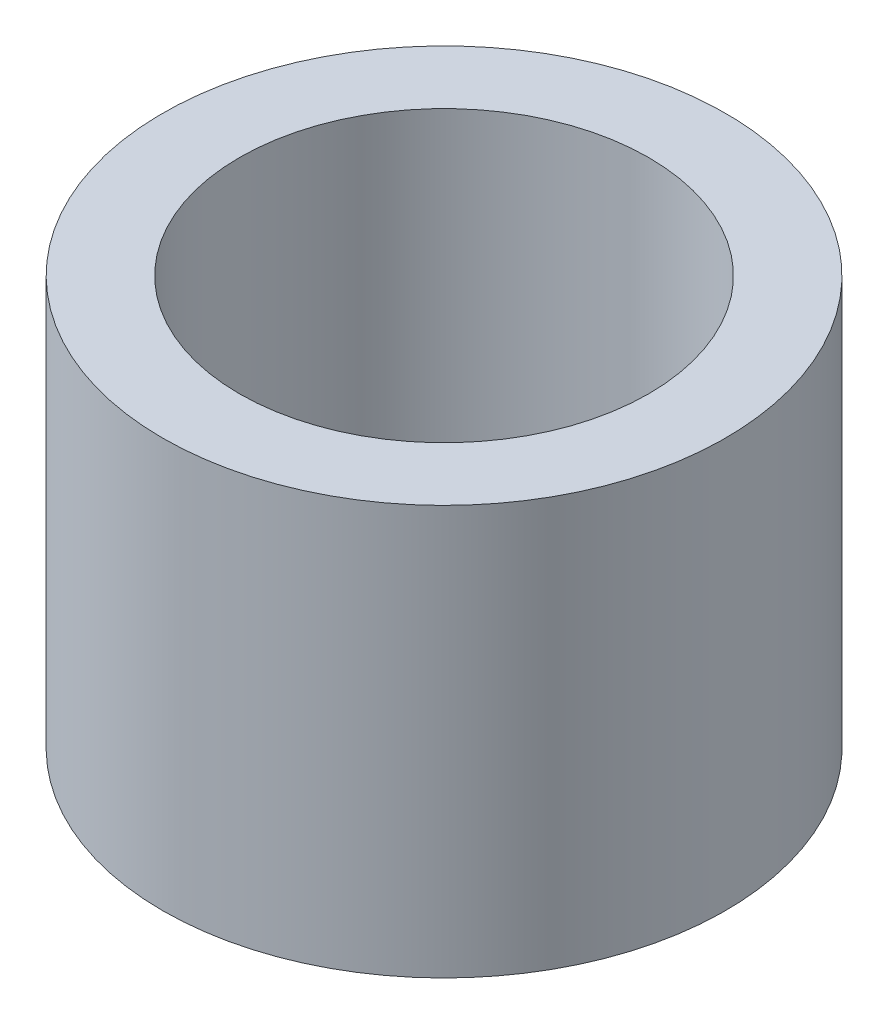
ISO-10303-21;
HEADER;
FILE_DESCRIPTION(('STEP AP214'),'2;1');
FILE_NAME('part.step','',(''),(''),'','','');
FILE_SCHEMA(('AUTOMOTIVE_DESIGN { 1 0 10303 214 1 1 1 1 }'));
ENDSEC;
DATA;
#1=APPLICATION_CONTEXT('core data for automotive mechanical design processes');
#2=APPLICATION_PROTOCOL_DEFINITION('international standard','automotive_design',2000,#1);
#3=PRODUCT_CONTEXT('',#1,'mechanical');
#4=PRODUCT('Part','Part','',(#3));
#5=PRODUCT_RELATED_PRODUCT_CATEGORY('part','',(#4));
#6=PRODUCT_DEFINITION_FORMATION('','',#4);
#7=PRODUCT_DEFINITION_CONTEXT('part definition',#1,'design');
#8=PRODUCT_DEFINITION('design','',#6,#7);
#9=PRODUCT_DEFINITION_SHAPE('','',#8);
#10=(LENGTH_UNIT() NAMED_UNIT(*) SI_UNIT(.MILLI.,.METRE.));
#11=(NAMED_UNIT(*) PLANE_ANGLE_UNIT() SI_UNIT($,.RADIAN.));
#12=(NAMED_UNIT(*) SI_UNIT($,.STERADIAN.) SOLID_ANGLE_UNIT());
#13=UNCERTAINTY_MEASURE_WITH_UNIT(LENGTH_MEASURE(1.E-05),#10,'distance_accuracy_value','');
#14=(GEOMETRIC_REPRESENTATION_CONTEXT(3) GLOBAL_UNCERTAINTY_ASSIGNED_CONTEXT((#13)) GLOBAL_UNIT_ASSIGNED_CONTEXT((#10,
#11,#12)) REPRESENTATION_CONTEXT('',''));
#15=CARTESIAN_POINT('',(0.,0.,0.));
#16=DIRECTION('',(0.,0.,1.));
#17=DIRECTION('',(1.,0.,0.));
#18=AXIS2_PLACEMENT_3D('',#15,#16,#17);
#19=CARTESIAN_POINT('',(0.,16.,0.));
#20=DIRECTION('',(0.,1.,0.));
#21=DIRECTION('',(0.,0.,1.));
#22=AXIS2_PLACEMENT_3D('',#19,#20,#21);
#23=PLANE('',#22);
#24=CARTESIAN_POINT('',(0.,16.,0.));
#25=DIRECTION('',(0.,1.,0.));
#26=DIRECTION('',(0.,0.,1.));
#27=AXIS2_PLACEMENT_3D('',#24,#25,#26);
#28=CIRCLE('',#27,11.);
#29=CARTESIAN_POINT('',(0.,16.,11.));
#30=VERTEX_POINT('',#29);
#31=EDGE_CURVE('E10',#30,#30,#28,.T.);
#32=ORIENTED_EDGE('',*,*,#31,.T.);
#33=EDGE_LOOP('',(#32));
#34=FACE_BOUND('',#33,.T.);
#35=CARTESIAN_POINT('',(0.,16.,0.));
#36=DIRECTION('',(0.,1.,0.));
#37=DIRECTION('',(0.,0.,1.));
#38=AXIS2_PLACEMENT_3D('',#35,#36,#37);
#39=CIRCLE('',#38,8.);
#40=CARTESIAN_POINT('',(0.,16.,8.));
#41=VERTEX_POINT('',#40);
#42=EDGE_CURVE('E46',#41,#41,#39,.T.);
#43=ORIENTED_EDGE('',*,*,#42,.F.);
#44=EDGE_LOOP('',(#43));
#45=FACE_BOUND('',#44,.T.);
#46=ADVANCED_FACE('F35',(#34,#45),#23,.T.);
#47=CARTESIAN_POINT('',(0.,0.,0.));
#48=DIRECTION('',(0.,1.,0.));
#49=DIRECTION('',(0.,0.,1.));
#50=AXIS2_PLACEMENT_3D('',#47,#48,#49);
#51=PLANE('',#50);
#52=CARTESIAN_POINT('',(0.,0.,0.));
#53=DIRECTION('',(0.,1.,0.));
#54=DIRECTION('',(0.,0.,1.));
#55=AXIS2_PLACEMENT_3D('',#52,#53,#54);
#56=CIRCLE('',#55,11.);
#57=CARTESIAN_POINT('',(0.,0.,11.));
#58=VERTEX_POINT('',#57);
#59=EDGE_CURVE('E39',#58,#58,#56,.T.);
#60=ORIENTED_EDGE('',*,*,#59,.F.);
#61=EDGE_LOOP('',(#60));
#62=FACE_BOUND('',#61,.T.);
#63=CARTESIAN_POINT('',(0.,0.,0.));
#64=DIRECTION('',(0.,1.,0.));
#65=DIRECTION('',(0.,0.,1.));
#66=AXIS2_PLACEMENT_3D('',#63,#64,#65);
#67=CIRCLE('',#66,8.);
#68=CARTESIAN_POINT('',(0.,0.,8.));
#69=VERTEX_POINT('',#68);
#70=EDGE_CURVE('E48',#69,#69,#67,.T.);
#71=ORIENTED_EDGE('',*,*,#70,.T.);
#72=EDGE_LOOP('',(#71));
#73=FACE_BOUND('',#72,.T.);
#74=ADVANCED_FACE('F58',(#62,#73),#51,.F.);
#75=CARTESIAN_POINT('',(0.,16.,0.));
#76=DIRECTION('',(0.,-1.,0.));
#77=DIRECTION('',(0.,0.,-1.));
#78=AXIS2_PLACEMENT_3D('',#75,#76,#77);
#79=CYLINDRICAL_SURFACE('',#78,11.);
#80=ORIENTED_EDGE('',*,*,#31,.F.);
#81=EDGE_LOOP('',(#80));
#82=FACE_BOUND('',#81,.T.);
#83=ORIENTED_EDGE('',*,*,#59,.T.);
#84=EDGE_LOOP('',(#83));
#85=FACE_BOUND('',#84,.T.);
#86=ADVANCED_FACE('F37',(#82,#85),#79,.T.);
#87=CARTESIAN_POINT('',(0.,16.,0.));
#88=DIRECTION('',(0.,-1.,0.));
#89=DIRECTION('',(0.,0.,-1.));
#90=AXIS2_PLACEMENT_3D('',#87,#88,#89);
#91=CYLINDRICAL_SURFACE('',#90,8.);
#92=ORIENTED_EDGE('',*,*,#42,.T.);
#93=EDGE_LOOP('',(#92));
#94=FACE_BOUND('',#93,.T.);
#95=ORIENTED_EDGE('',*,*,#70,.F.);
#96=EDGE_LOOP('',(#95));
#97=FACE_BOUND('',#96,.T.);
#98=ADVANCED_FACE('F54',(#94,#97),#91,.F.);
#99=CLOSED_SHELL('',(#46,#74,#86,#98));
#100=MANIFOLD_SOLID_BREP('B2',#99);
#101=ADVANCED_BREP_SHAPE_REPRESENTATION('',(#18,#100),#14);
#102=SHAPE_DEFINITION_REPRESENTATION(#9,#101);
ENDSEC;
END-ISO-10303-21;
